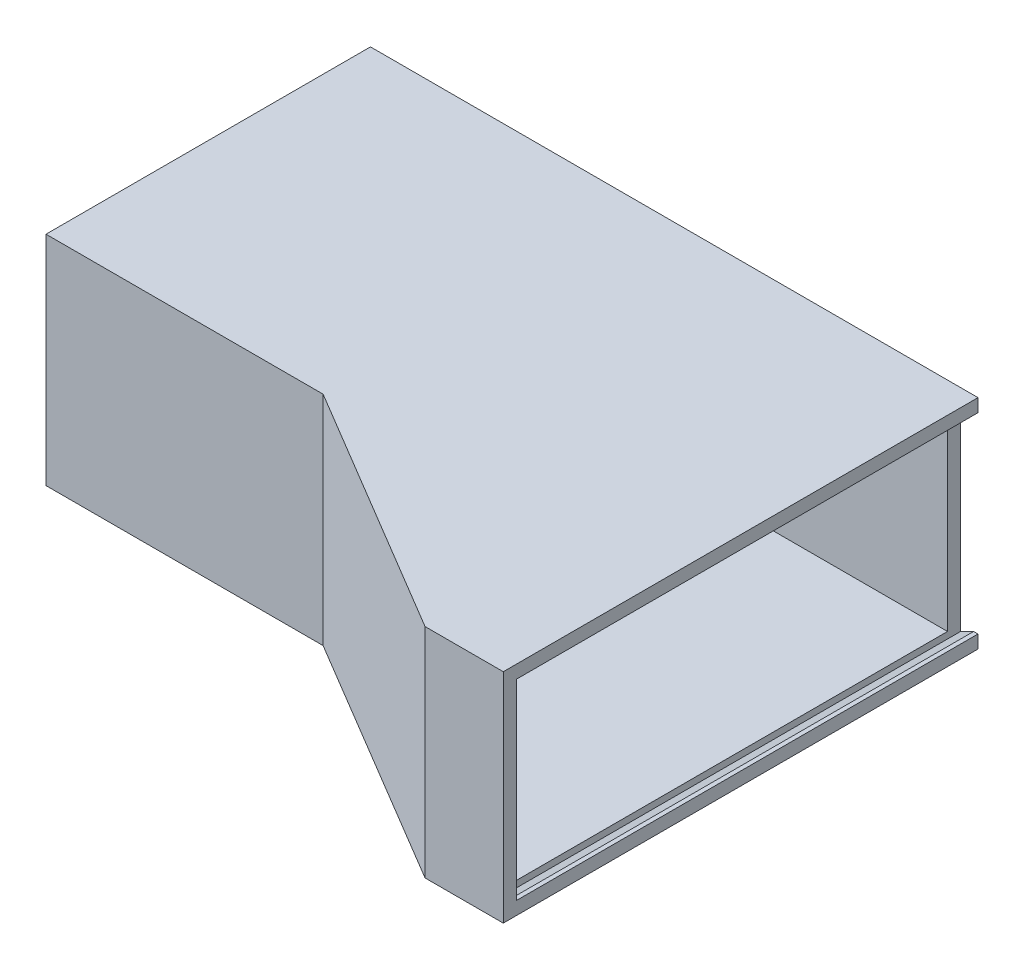
ISO-10303-21;
HEADER;
FILE_DESCRIPTION(('STEP AP214'),'2;1');
FILE_NAME('part.step','',(''),(''),'','','');
FILE_SCHEMA(('AUTOMOTIVE_DESIGN { 1 0 10303 214 1 1 1 1 }'));
ENDSEC;
DATA;
#1=APPLICATION_CONTEXT('core data for automotive mechanical design processes');
#2=APPLICATION_PROTOCOL_DEFINITION('international standard','automotive_design',2000,#1);
#3=PRODUCT_CONTEXT('',#1,'mechanical');
#4=PRODUCT('Part','Part','',(#3));
#5=PRODUCT_RELATED_PRODUCT_CATEGORY('part','',(#4));
#6=PRODUCT_DEFINITION_FORMATION('','',#4);
#7=PRODUCT_DEFINITION_CONTEXT('part definition',#1,'design');
#8=PRODUCT_DEFINITION('design','',#6,#7);
#9=PRODUCT_DEFINITION_SHAPE('','',#8);
#10=(LENGTH_UNIT() NAMED_UNIT(*) SI_UNIT(.MILLI.,.METRE.));
#11=(NAMED_UNIT(*) PLANE_ANGLE_UNIT() SI_UNIT($,.RADIAN.));
#12=(NAMED_UNIT(*) SI_UNIT($,.STERADIAN.) SOLID_ANGLE_UNIT());
#13=UNCERTAINTY_MEASURE_WITH_UNIT(LENGTH_MEASURE(1.E-05),#10,'distance_accuracy_value','');
#14=(GEOMETRIC_REPRESENTATION_CONTEXT(3) GLOBAL_UNCERTAINTY_ASSIGNED_CONTEXT((#13)) GLOBAL_UNIT_ASSIGNED_CONTEXT((#10,
#11,#12)) REPRESENTATION_CONTEXT('',''));
#15=CARTESIAN_POINT('',(0.,0.,0.));
#16=DIRECTION('',(0.,0.,1.));
#17=DIRECTION('',(1.,0.,0.));
#18=AXIS2_PLACEMENT_3D('',#15,#16,#17);
#19=CARTESIAN_POINT('',(0.,25.,-3.5));
#20=DIRECTION('',(0.,0.,-1.));
#21=DIRECTION('',(-1.,0.,0.));
#22=AXIS2_PLACEMENT_3D('',#19,#20,#21);
#23=PLANE('',#22);
#24=DIRECTION('',(-0.894427190999916,-0.447213595499958,0.));
#25=VECTOR('',#24,1.);
#26=CARTESIAN_POINT('',(35.8,-71.6,-3.5));
#27=LINE('',#26,#25);
#28=CARTESIAN_POINT('',(135.,-22.,-3.5));
#29=VERTEX_POINT('',#28);
#30=CARTESIAN_POINT('',(132.,-23.5,-3.5));
#31=VERTEX_POINT('',#30);
#32=EDGE_CURVE('E180',#29,#31,#27,.T.);
#33=ORIENTED_EDGE('',*,*,#32,.F.);
#34=DIRECTION('',(1.,0.,0.));
#35=VECTOR('',#34,1.);
#36=CARTESIAN_POINT('',(0.,-22.,-3.5));
#37=LINE('',#36,#35);
#38=CARTESIAN_POINT('',(136.,-22.,-3.5));
#39=VERTEX_POINT('',#38);
#40=EDGE_CURVE('E243',#29,#39,#37,.T.);
#41=ORIENTED_EDGE('',*,*,#40,.T.);
#42=DIRECTION('',(0.,-1.,0.));
#43=VECTOR('',#42,1.);
#44=CARTESIAN_POINT('',(136.,-22.,-3.5));
#45=LINE('',#44,#43);
#46=CARTESIAN_POINT('',(136.,-25.,-3.5));
#47=VERTEX_POINT('',#46);
#48=EDGE_CURVE('E250',#39,#47,#45,.T.);
#49=ORIENTED_EDGE('',*,*,#48,.T.);
#50=DIRECTION('',(1.,0.,0.));
#51=VECTOR('',#50,1.);
#52=CARTESIAN_POINT('',(0.,-25.,-3.5));
#53=LINE('',#52,#51);
#54=CARTESIAN_POINT('',(-3.5,-25.,-3.5));
#55=VERTEX_POINT('',#54);
#56=EDGE_CURVE('E274',#55,#47,#53,.T.);
#57=ORIENTED_EDGE('',*,*,#56,.F.);
#58=DIRECTION('',(0.,-1.,0.));
#59=VECTOR('',#58,1.);
#60=CARTESIAN_POINT('',(-3.5,25.,-3.5));
#61=LINE('',#60,#59);
#62=CARTESIAN_POINT('',(-3.5,25.,-3.5));
#63=VERTEX_POINT('',#62);
#64=EDGE_CURVE('E202',#63,#55,#61,.T.);
#65=ORIENTED_EDGE('',*,*,#64,.F.);
#66=DIRECTION('',(1.,0.,0.));
#67=VECTOR('',#66,1.);
#68=CARTESIAN_POINT('',(0.,25.,-3.5));
#69=LINE('',#68,#67);
#70=CARTESIAN_POINT('',(136.,25.,-3.5));
#71=VERTEX_POINT('',#70);
#72=EDGE_CURVE('E332',#63,#71,#69,.T.);
#73=ORIENTED_EDGE('',*,*,#72,.T.);
#74=DIRECTION('',(0.,1.,0.));
#75=VECTOR('',#74,1.);
#76=CARTESIAN_POINT('',(136.,22.,-3.5));
#77=LINE('',#76,#75);
#78=CARTESIAN_POINT('',(136.,22.,-3.5));
#79=VERTEX_POINT('',#78);
#80=EDGE_CURVE('E328',#79,#71,#77,.T.);
#81=ORIENTED_EDGE('',*,*,#80,.F.);
#82=DIRECTION('',(1.,0.,0.));
#83=VECTOR('',#82,1.);
#84=CARTESIAN_POINT('',(0.,22.,-3.5));
#85=LINE('',#84,#83);
#86=CARTESIAN_POINT('',(135.,22.,-3.5));
#87=VERTEX_POINT('',#86);
#88=EDGE_CURVE('E309',#87,#79,#85,.T.);
#89=ORIENTED_EDGE('',*,*,#88,.F.);
#90=DIRECTION('',(-0.894427190999916,0.447213595499958,0.));
#91=VECTOR('',#90,1.);
#92=CARTESIAN_POINT('',(35.8,71.6,-3.5));
#93=LINE('',#92,#91);
#94=CARTESIAN_POINT('',(132.,23.5,-3.5));
#95=VERTEX_POINT('',#94);
#96=EDGE_CURVE('E197',#87,#95,#93,.T.);
#97=ORIENTED_EDGE('',*,*,#96,.T.);
#98=DIRECTION('',(0.,-1.,0.));
#99=VECTOR('',#98,1.);
#100=CARTESIAN_POINT('',(132.,25.,-3.5));
#101=LINE('',#100,#99);
#102=EDGE_CURVE('E194',#95,#31,#101,.T.);
#103=ORIENTED_EDGE('',*,*,#102,.T.);
#104=EDGE_LOOP('',(#33,#41,#49,#57,#65,#73,#81,#89,#97,#103));
#105=FACE_BOUND('',#104,.T.);
#106=ADVANCED_FACE('F47',(#105),#23,.T.);
#107=CARTESIAN_POINT('',(0.,-22.,0.));
#108=DIRECTION('',(0.,-1.,0.));
#109=DIRECTION('',(0.,0.,1.));
#110=AXIS2_PLACEMENT_3D('',#107,#108,#109);
#111=PLANE('',#110);
#112=DIRECTION('',(0.,0.,-1.));
#113=VECTOR('',#112,1.);
#114=CARTESIAN_POINT('',(132.,-22.,-3.5));
#115=LINE('',#114,#113);
#116=CARTESIAN_POINT('',(132.,-22.,102.5));
#117=VERTEX_POINT('',#116);
#118=CARTESIAN_POINT('',(132.,-22.,-0.5));
#119=VERTEX_POINT('',#118);
#120=EDGE_CURVE('E215',#117,#119,#115,.T.);
#121=ORIENTED_EDGE('',*,*,#120,.T.);
#122=DIRECTION('',(1.,0.,0.));
#123=VECTOR('',#122,1.);
#124=CARTESIAN_POINT('',(0.,-22.,-0.5));
#125=LINE('',#124,#123);
#126=CARTESIAN_POINT('',(-0.5,-22.,-0.5));
#127=VERTEX_POINT('',#126);
#128=EDGE_CURVE('E239',#127,#119,#125,.T.);
#129=ORIENTED_EDGE('',*,*,#128,.F.);
#130=DIRECTION('',(0.,0.,-1.));
#131=VECTOR('',#130,1.);
#132=CARTESIAN_POINT('',(-0.5,-22.,0.));
#133=LINE('',#132,#131);
#134=CARTESIAN_POINT('',(-0.5,-22.,68.));
#135=VERTEX_POINT('',#134);
#136=EDGE_CURVE('E235',#135,#127,#133,.T.);
#137=ORIENTED_EDGE('',*,*,#136,.F.);
#138=DIRECTION('',(-1.,0.,0.));
#139=VECTOR('',#138,1.);
#140=CARTESIAN_POINT('',(0.,-22.,68.));
#141=LINE('',#140,#139);
#142=CARTESIAN_POINT('',(71.5,-22.,68.));
#143=VERTEX_POINT('',#142);
#144=EDGE_CURVE('E231',#143,#135,#141,.T.);
#145=ORIENTED_EDGE('',*,*,#144,.F.);
#146=DIRECTION('',(0.,0.,-1.));
#147=VECTOR('',#146,1.);
#148=CARTESIAN_POINT('',(71.5,-22.,0.));
#149=LINE('',#148,#147);
#150=CARTESIAN_POINT('',(71.5,-22.,74.2841310368762));
#151=VERTEX_POINT('',#150);
#152=EDGE_CURVE('E227',#151,#143,#149,.T.);
#153=ORIENTED_EDGE('',*,*,#152,.F.);
#154=DIRECTION('',(-0.859101543908756,0.,-0.511805175094578));
#155=VECTOR('',#154,1.);
#156=CARTESIAN_POINT('',(-13.9331494970027,-22.,23.3877866556831));
#157=LINE('',#156,#155);
#158=CARTESIAN_POINT('',(118.862351473815,-22.,102.5));
#159=VERTEX_POINT('',#158);
#160=EDGE_CURVE('E223',#159,#151,#157,.T.);
#161=ORIENTED_EDGE('',*,*,#160,.F.);
#162=DIRECTION('',(-1.,0.,0.));
#163=VECTOR('',#162,1.);
#164=CARTESIAN_POINT('',(0.,-22.,102.5));
#165=LINE('',#164,#163);
#166=EDGE_CURVE('E209',#117,#159,#165,.T.);
#167=ORIENTED_EDGE('',*,*,#166,.F.);
#168=EDGE_LOOP('',(#121,#129,#137,#145,#153,#161,#167));
#169=FACE_BOUND('',#168,.T.);
#170=ADVANCED_FACE('F395',(#169),#111,.F.);
#171=DIRECTION('',(0.,0.,1.));
#172=VECTOR('',#171,1.);
#173=CARTESIAN_POINT('',(135.,-22.,-3.5));
#174=LINE('',#173,#172);
#175=CARTESIAN_POINT('',(135.,-22.,102.5));
#176=VERTEX_POINT('',#175);
#177=EDGE_CURVE('E187',#29,#176,#174,.T.);
#178=ORIENTED_EDGE('',*,*,#177,.T.);
#179=CARTESIAN_POINT('',(136.,-22.,102.5));
#180=VERTEX_POINT('',#179);
#181=EDGE_CURVE('E213',#180,#176,#165,.T.);
#182=ORIENTED_EDGE('',*,*,#181,.F.);
#183=DIRECTION('',(0.,0.,-1.));
#184=VECTOR('',#183,1.);
#185=CARTESIAN_POINT('',(136.,-22.,0.));
#186=LINE('',#185,#184);
#187=EDGE_CURVE('E246',#180,#39,#186,.T.);
#188=ORIENTED_EDGE('',*,*,#187,.T.);
#189=ORIENTED_EDGE('',*,*,#40,.F.);
#190=EDGE_LOOP('',(#178,#182,#188,#189));
#191=FACE_BOUND('',#190,.T.);
#192=ADVANCED_FACE('F446',(#191),#111,.F.);
#193=CARTESIAN_POINT('',(0.,25.,102.5));
#194=DIRECTION('',(0.,0.,-1.));
#195=DIRECTION('',(-1.,0.,0.));
#196=AXIS2_PLACEMENT_3D('',#193,#194,#195);
#197=PLANE('',#196);
#198=ORIENTED_EDGE('',*,*,#181,.T.);
#199=DIRECTION('',(0.,-1.,0.));
#200=VECTOR('',#199,1.);
#201=CARTESIAN_POINT('',(135.,0.,102.5));
#202=LINE('',#201,#200);
#203=CARTESIAN_POINT('',(135.,22.,102.5));
#204=VERTEX_POINT('',#203);
#205=EDGE_CURVE('E284',#204,#176,#202,.T.);
#206=ORIENTED_EDGE('',*,*,#205,.F.);
#207=DIRECTION('',(-1.,0.,0.));
#208=VECTOR('',#207,1.);
#209=CARTESIAN_POINT('',(0.,22.,102.5));
#210=LINE('',#209,#208);
#211=CARTESIAN_POINT('',(136.,22.,102.5));
#212=VERTEX_POINT('',#211);
#213=EDGE_CURVE('E301',#212,#204,#210,.T.);
#214=ORIENTED_EDGE('',*,*,#213,.F.);
#215=DIRECTION('',(0.,-1.,0.));
#216=VECTOR('',#215,1.);
#217=CARTESIAN_POINT('',(136.,25.,102.5));
#218=LINE('',#217,#216);
#219=EDGE_CURVE('E372',#212,#180,#218,.T.);
#220=ORIENTED_EDGE('',*,*,#219,.T.);
#221=EDGE_LOOP('',(#198,#206,#214,#220));
#222=FACE_BOUND('',#221,.T.);
#223=ADVANCED_FACE('F458',(#222),#197,.T.);
#224=DIRECTION('',(0.,1.,0.));
#225=VECTOR('',#224,1.);
#226=CARTESIAN_POINT('',(132.,0.,102.5));
#227=LINE('',#226,#225);
#228=CARTESIAN_POINT('',(132.,22.,102.5));
#229=VERTEX_POINT('',#228);
#230=EDGE_CURVE('E294',#117,#229,#227,.T.);
#231=ORIENTED_EDGE('',*,*,#230,.F.);
#232=ORIENTED_EDGE('',*,*,#166,.T.);
#233=DIRECTION('',(0.,-1.,0.));
#234=VECTOR('',#233,1.);
#235=CARTESIAN_POINT('',(118.862351473815,25.,102.5));
#236=LINE('',#235,#234);
#237=CARTESIAN_POINT('',(118.862351473815,22.,102.5));
#238=VERTEX_POINT('',#237);
#239=EDGE_CURVE('E368',#238,#159,#236,.T.);
#240=ORIENTED_EDGE('',*,*,#239,.F.);
#241=EDGE_CURVE('E293',#229,#238,#210,.T.);
#242=ORIENTED_EDGE('',*,*,#241,.F.);
#243=EDGE_LOOP('',(#231,#232,#240,#242));
#244=FACE_BOUND('',#243,.T.);
#245=ADVANCED_FACE('F415',(#244),#197,.T.);
#246=CARTESIAN_POINT('',(0.,25.,-0.5));
#247=DIRECTION('',(0.,0.,-1.));
#248=DIRECTION('',(-1.,0.,0.));
#249=AXIS2_PLACEMENT_3D('',#246,#247,#248);
#250=PLANE('',#249);
#251=ORIENTED_EDGE('',*,*,#128,.T.);
#252=DIRECTION('',(0.,-1.,0.));
#253=VECTOR('',#252,1.);
#254=CARTESIAN_POINT('',(132.,25.,-0.5));
#255=LINE('',#254,#253);
#256=CARTESIAN_POINT('',(132.,22.,-0.5));
#257=VERTEX_POINT('',#256);
#258=EDGE_CURVE('E56',#257,#119,#255,.T.);
#259=ORIENTED_EDGE('',*,*,#258,.F.);
#260=DIRECTION('',(1.,0.,0.));
#261=VECTOR('',#260,1.);
#262=CARTESIAN_POINT('',(0.,22.,-0.5));
#263=LINE('',#262,#261);
#264=CARTESIAN_POINT('',(-0.5,22.,-0.5));
#265=VERTEX_POINT('',#264);
#266=EDGE_CURVE('E312',#265,#257,#263,.T.);
#267=ORIENTED_EDGE('',*,*,#266,.F.);
#268=DIRECTION('',(0.,-1.,0.));
#269=VECTOR('',#268,1.);
#270=CARTESIAN_POINT('',(-0.5,25.,-0.5));
#271=LINE('',#270,#269);
#272=EDGE_CURVE('E352',#265,#127,#271,.T.);
#273=ORIENTED_EDGE('',*,*,#272,.T.);
#274=EDGE_LOOP('',(#251,#259,#267,#273));
#275=FACE_BOUND('',#274,.T.);
#276=ADVANCED_FACE('F49',(#275),#250,.F.);
#277=CARTESIAN_POINT('',(132.,25.,0.));
#278=DIRECTION('',(-1.,0.,0.));
#279=DIRECTION('',(0.,0.,1.));
#280=AXIS2_PLACEMENT_3D('',#277,#278,#279);
#281=PLANE('',#280);
#282=DIRECTION('',(0.,0.,-1.));
#283=VECTOR('',#282,1.);
#284=CARTESIAN_POINT('',(132.,-23.5,-3.5));
#285=LINE('',#284,#283);
#286=CARTESIAN_POINT('',(132.,-23.5,104.));
#287=VERTEX_POINT('',#286);
#288=EDGE_CURVE('E184',#287,#31,#285,.T.);
#289=ORIENTED_EDGE('',*,*,#288,.T.);
#290=ORIENTED_EDGE('',*,*,#102,.F.);
#291=DIRECTION('',(0.,0.,-1.));
#292=VECTOR('',#291,1.);
#293=CARTESIAN_POINT('',(132.,23.5,-3.5));
#294=LINE('',#293,#292);
#295=CARTESIAN_POINT('',(132.,23.5,104.));
#296=VERTEX_POINT('',#295);
#297=EDGE_CURVE('E281',#296,#95,#294,.T.);
#298=ORIENTED_EDGE('',*,*,#297,.F.);
#299=DIRECTION('',(0.,1.,0.));
#300=VECTOR('',#299,1.);
#301=CARTESIAN_POINT('',(132.,0.,104.));
#302=LINE('',#301,#300);
#303=EDGE_CURVE('E207',#287,#296,#302,.T.);
#304=ORIENTED_EDGE('',*,*,#303,.F.);
#305=EDGE_LOOP('',(#289,#290,#298,#304));
#306=FACE_BOUND('',#305,.T.);
#307=ORIENTED_EDGE('',*,*,#258,.T.);
#308=ORIENTED_EDGE('',*,*,#120,.F.);
#309=ORIENTED_EDGE('',*,*,#230,.T.);
#310=DIRECTION('',(0.,0.,-1.));
#311=VECTOR('',#310,1.);
#312=CARTESIAN_POINT('',(132.,22.,-3.5));
#313=LINE('',#312,#311);
#314=EDGE_CURVE('E280',#229,#257,#313,.T.);
#315=ORIENTED_EDGE('',*,*,#314,.T.);
#316=EDGE_LOOP('',(#307,#308,#309,#315));
#317=FACE_BOUND('',#316,.T.);
#318=ADVANCED_FACE('F205',(#306,#317),#281,.F.);
#319=CARTESIAN_POINT('',(-13.9331494970027,25.,23.3877866556831));
#320=DIRECTION('',(0.511805175094578,0.,-0.859101543908756));
#321=DIRECTION('',(-0.859101543908756,0.,-0.511805175094578));
#322=AXIS2_PLACEMENT_3D('',#319,#320,#321);
#323=PLANE('',#322);
#324=ORIENTED_EDGE('',*,*,#239,.T.);
#325=ORIENTED_EDGE('',*,*,#160,.T.);
#326=DIRECTION('',(0.,-1.,0.));
#327=VECTOR('',#326,1.);
#328=CARTESIAN_POINT('',(71.5,25.,74.2841310368762));
#329=LINE('',#328,#327);
#330=CARTESIAN_POINT('',(71.5,22.,74.2841310368762));
#331=VERTEX_POINT('',#330);
#332=EDGE_CURVE('E364',#331,#151,#329,.T.);
#333=ORIENTED_EDGE('',*,*,#332,.F.);
#334=DIRECTION('',(-0.859101543908756,0.,-0.511805175094578));
#335=VECTOR('',#334,1.);
#336=CARTESIAN_POINT('',(-13.9331494970027,22.,23.3877866556831));
#337=LINE('',#336,#335);
#338=EDGE_CURVE('E325',#238,#331,#337,.T.);
#339=ORIENTED_EDGE('',*,*,#338,.F.);
#340=EDGE_LOOP('',(#324,#325,#333,#339));
#341=FACE_BOUND('',#340,.T.);
#342=ADVANCED_FACE('F412',(#341),#323,.T.);
#343=CARTESIAN_POINT('',(71.5,25.,0.));
#344=DIRECTION('',(1.,0.,0.));
#345=DIRECTION('',(0.,0.,-1.));
#346=AXIS2_PLACEMENT_3D('',#343,#344,#345);
#347=PLANE('',#346);
#348=ORIENTED_EDGE('',*,*,#332,.T.);
#349=ORIENTED_EDGE('',*,*,#152,.T.);
#350=DIRECTION('',(0.,-1.,0.));
#351=VECTOR('',#350,1.);
#352=CARTESIAN_POINT('',(71.5,25.,68.));
#353=LINE('',#352,#351);
#354=CARTESIAN_POINT('',(71.5,22.,68.));
#355=VERTEX_POINT('',#354);
#356=EDGE_CURVE('E360',#355,#143,#353,.T.);
#357=ORIENTED_EDGE('',*,*,#356,.F.);
#358=DIRECTION('',(0.,0.,-1.));
#359=VECTOR('',#358,1.);
#360=CARTESIAN_POINT('',(71.5,22.,0.));
#361=LINE('',#360,#359);
#362=EDGE_CURVE('E322',#331,#355,#361,.T.);
#363=ORIENTED_EDGE('',*,*,#362,.F.);
#364=EDGE_LOOP('',(#348,#349,#357,#363));
#365=FACE_BOUND('',#364,.T.);
#366=ADVANCED_FACE('F407',(#365),#347,.T.);
#367=CARTESIAN_POINT('',(0.,25.,68.));
#368=DIRECTION('',(0.,0.,-1.));
#369=DIRECTION('',(-1.,0.,0.));
#370=AXIS2_PLACEMENT_3D('',#367,#368,#369);
#371=PLANE('',#370);
#372=ORIENTED_EDGE('',*,*,#356,.T.);
#373=ORIENTED_EDGE('',*,*,#144,.T.);
#374=DIRECTION('',(0.,-1.,0.));
#375=VECTOR('',#374,1.);
#376=CARTESIAN_POINT('',(-0.5,25.,68.));
#377=LINE('',#376,#375);
#378=CARTESIAN_POINT('',(-0.5,22.,68.));
#379=VERTEX_POINT('',#378);
#380=EDGE_CURVE('E356',#379,#135,#377,.T.);
#381=ORIENTED_EDGE('',*,*,#380,.F.);
#382=DIRECTION('',(-1.,0.,0.));
#383=VECTOR('',#382,1.);
#384=CARTESIAN_POINT('',(0.,22.,68.));
#385=LINE('',#384,#383);
#386=EDGE_CURVE('E319',#355,#379,#385,.T.);
#387=ORIENTED_EDGE('',*,*,#386,.F.);
#388=EDGE_LOOP('',(#372,#373,#381,#387));
#389=FACE_BOUND('',#388,.T.);
#390=ADVANCED_FACE('F403',(#389),#371,.T.);
#391=CARTESIAN_POINT('',(-0.5,25.,0.));
#392=DIRECTION('',(1.,0.,0.));
#393=DIRECTION('',(0.,0.,-1.));
#394=AXIS2_PLACEMENT_3D('',#391,#392,#393);
#395=PLANE('',#394);
#396=ORIENTED_EDGE('',*,*,#380,.T.);
#397=ORIENTED_EDGE('',*,*,#136,.T.);
#398=ORIENTED_EDGE('',*,*,#272,.F.);
#399=DIRECTION('',(0.,0.,-1.));
#400=VECTOR('',#399,1.);
#401=CARTESIAN_POINT('',(-0.5,22.,0.));
#402=LINE('',#401,#400);
#403=EDGE_CURVE('E316',#379,#265,#402,.T.);
#404=ORIENTED_EDGE('',*,*,#403,.F.);
#405=EDGE_LOOP('',(#396,#397,#398,#404));
#406=FACE_BOUND('',#405,.T.);
#407=ADVANCED_FACE('F398',(#406),#395,.T.);
#408=CARTESIAN_POINT('',(135.,0.,102.5));
#409=DIRECTION('',(0.447213595499958,0.,0.894427190999916));
#410=DIRECTION('',(0.894427190999916,0.,-0.447213595499958));
#411=AXIS2_PLACEMENT_3D('',#408,#409,#410);
#412=PLANE('',#411);
#413=ORIENTED_EDGE('',*,*,#205,.T.);
#414=DIRECTION('',(-0.816496580927726,-0.408248290463863,0.408248290463863));
#415=VECTOR('',#414,1.);
#416=CARTESIAN_POINT('',(142.333333333333,-18.3333333333333,98.8333333333333));
#417=LINE('',#416,#415);
#418=EDGE_CURVE('E191',#176,#287,#417,.T.);
#419=ORIENTED_EDGE('',*,*,#418,.T.);
#420=ORIENTED_EDGE('',*,*,#303,.T.);
#421=DIRECTION('',(-0.816496580927726,0.408248290463863,0.408248290463863));
#422=VECTOR('',#421,1.);
#423=CARTESIAN_POINT('',(142.333333333333,18.3333333333333,98.8333333333333));
#424=LINE('',#423,#422);
#425=EDGE_CURVE('E11',#204,#296,#424,.T.);
#426=ORIENTED_EDGE('',*,*,#425,.F.);
#427=EDGE_LOOP('',(#413,#419,#420,#426));
#428=FACE_BOUND('',#427,.T.);
#429=ADVANCED_FACE('F422',(#428),#412,.F.);
#430=CARTESIAN_POINT('',(0.,22.,0.));
#431=DIRECTION('',(0.,1.,0.));
#432=DIRECTION('',(0.,0.,1.));
#433=AXIS2_PLACEMENT_3D('',#430,#431,#432);
#434=PLANE('',#433);
#435=ORIENTED_EDGE('',*,*,#266,.T.);
#436=ORIENTED_EDGE('',*,*,#314,.F.);
#437=ORIENTED_EDGE('',*,*,#241,.T.);
#438=ORIENTED_EDGE('',*,*,#338,.T.);
#439=ORIENTED_EDGE('',*,*,#362,.T.);
#440=ORIENTED_EDGE('',*,*,#386,.T.);
#441=ORIENTED_EDGE('',*,*,#403,.T.);
#442=EDGE_LOOP('',(#435,#436,#437,#438,#439,#440,#441));
#443=FACE_BOUND('',#442,.T.);
#444=ADVANCED_FACE('F419',(#443),#434,.F.);
#445=CARTESIAN_POINT('',(-3.5,25.,0.));
#446=DIRECTION('',(1.,0.,0.));
#447=DIRECTION('',(0.,0.,-1.));
#448=AXIS2_PLACEMENT_3D('',#445,#446,#447);
#449=PLANE('',#448);
#450=ORIENTED_EDGE('',*,*,#64,.T.);
#451=DIRECTION('',(0.,0.,1.));
#452=VECTOR('',#451,1.);
#453=CARTESIAN_POINT('',(-3.5,-25.,0.));
#454=LINE('',#453,#452);
#455=CARTESIAN_POINT('',(-3.5,-25.,71.));
#456=VERTEX_POINT('',#455);
#457=EDGE_CURVE('E270',#55,#456,#454,.T.);
#458=ORIENTED_EDGE('',*,*,#457,.T.);
#459=DIRECTION('',(0.,-1.,0.));
#460=VECTOR('',#459,1.);
#461=CARTESIAN_POINT('',(-3.5,25.,71.));
#462=LINE('',#461,#460);
#463=CARTESIAN_POINT('',(-3.5,25.,71.));
#464=VERTEX_POINT('',#463);
#465=EDGE_CURVE('E383',#464,#456,#462,.T.);
#466=ORIENTED_EDGE('',*,*,#465,.F.);
#467=DIRECTION('',(0.,0.,1.));
#468=VECTOR('',#467,1.);
#469=CARTESIAN_POINT('',(-3.5,25.,0.));
#470=LINE('',#469,#468);
#471=EDGE_CURVE('E336',#63,#464,#470,.T.);
#472=ORIENTED_EDGE('',*,*,#471,.F.);
#473=EDGE_LOOP('',(#450,#458,#466,#472));
#474=FACE_BOUND('',#473,.T.);
#475=ADVANCED_FACE('F421',(#474),#449,.F.);
#476=CARTESIAN_POINT('',(0.,25.,71.));
#477=DIRECTION('',(0.,0.,-1.));
#478=DIRECTION('',(-1.,0.,0.));
#479=AXIS2_PLACEMENT_3D('',#476,#477,#478);
#480=PLANE('',#479);
#481=ORIENTED_EDGE('',*,*,#465,.T.);
#482=DIRECTION('',(1.,0.,0.));
#483=VECTOR('',#482,1.);
#484=CARTESIAN_POINT('',(0.,-25.,71.));
#485=LINE('',#484,#483);
#486=CARTESIAN_POINT('',(60.1257460309908,-25.,71.));
#487=VERTEX_POINT('',#486);
#488=EDGE_CURVE('E266',#456,#487,#485,.T.);
#489=ORIENTED_EDGE('',*,*,#488,.T.);
#490=DIRECTION('',(0.,-1.,0.));
#491=VECTOR('',#490,1.);
#492=CARTESIAN_POINT('',(60.1257460309908,25.,71.));
#493=LINE('',#492,#491);
#494=CARTESIAN_POINT('',(60.1257460309908,25.,71.));
#495=VERTEX_POINT('',#494);
#496=EDGE_CURVE('E380',#495,#487,#493,.T.);
#497=ORIENTED_EDGE('',*,*,#496,.F.);
#498=DIRECTION('',(1.,0.,0.));
#499=VECTOR('',#498,1.);
#500=CARTESIAN_POINT('',(0.,25.,71.));
#501=LINE('',#500,#499);
#502=EDGE_CURVE('E339',#464,#495,#501,.T.);
#503=ORIENTED_EDGE('',*,*,#502,.F.);
#504=EDGE_LOOP('',(#481,#489,#497,#503));
#505=FACE_BOUND('',#504,.T.);
#506=ADVANCED_FACE('F430',(#505),#480,.F.);
#507=CARTESIAN_POINT('',(-15.4685650222864,25.,25.9650912874093));
#508=DIRECTION('',(-0.511805175094578,0.,0.859101543908756));
#509=DIRECTION('',(0.859101543908756,0.,0.511805175094578));
#510=AXIS2_PLACEMENT_3D('',#507,#508,#509);
#511=PLANE('',#510);
#512=ORIENTED_EDGE('',*,*,#496,.T.);
#513=DIRECTION('',(-0.859101543908756,0.,-0.511805175094578));
#514=VECTOR('',#513,1.);
#515=CARTESIAN_POINT('',(-15.4685650222864,-25.,25.9650912874093));
#516=LINE('',#515,#514);
#517=CARTESIAN_POINT('',(118.036460316705,-25.,105.5));
#518=VERTEX_POINT('',#517);
#519=EDGE_CURVE('E262',#518,#487,#516,.T.);
#520=ORIENTED_EDGE('',*,*,#519,.F.);
#521=DIRECTION('',(0.,-1.,0.));
#522=VECTOR('',#521,1.);
#523=CARTESIAN_POINT('',(118.036460316705,25.,105.5));
#524=LINE('',#523,#522);
#525=CARTESIAN_POINT('',(118.036460316705,25.,105.5));
#526=VERTEX_POINT('',#525);
#527=EDGE_CURVE('E71',#526,#518,#524,.T.);
#528=ORIENTED_EDGE('',*,*,#527,.F.);
#529=DIRECTION('',(-0.859101543908756,0.,-0.511805175094578));
#530=VECTOR('',#529,1.);
#531=CARTESIAN_POINT('',(-15.4685650222864,25.,25.9650912874093));
#532=LINE('',#531,#530);
#533=EDGE_CURVE('E342',#526,#495,#532,.T.);
#534=ORIENTED_EDGE('',*,*,#533,.T.);
#535=EDGE_LOOP('',(#512,#520,#528,#534));
#536=FACE_BOUND('',#535,.T.);
#537=ADVANCED_FACE('F473',(#536),#511,.T.);
#538=CARTESIAN_POINT('',(0.,25.,105.5));
#539=DIRECTION('',(0.,0.,1.));
#540=DIRECTION('',(1.,0.,0.));
#541=AXIS2_PLACEMENT_3D('',#538,#539,#540);
#542=PLANE('',#541);
#543=ORIENTED_EDGE('',*,*,#527,.T.);
#544=DIRECTION('',(-1.,0.,0.));
#545=VECTOR('',#544,1.);
#546=CARTESIAN_POINT('',(0.,-25.,105.5));
#547=LINE('',#546,#545);
#548=CARTESIAN_POINT('',(136.,-25.,105.5));
#549=VERTEX_POINT('',#548);
#550=EDGE_CURVE('E258',#549,#518,#547,.T.);
#551=ORIENTED_EDGE('',*,*,#550,.F.);
#552=DIRECTION('',(0.,-1.,0.));
#553=VECTOR('',#552,1.);
#554=CARTESIAN_POINT('',(136.,25.,105.5));
#555=LINE('',#554,#553);
#556=CARTESIAN_POINT('',(136.,25.,105.5));
#557=VERTEX_POINT('',#556);
#558=EDGE_CURVE('E63',#557,#549,#555,.T.);
#559=ORIENTED_EDGE('',*,*,#558,.F.);
#560=DIRECTION('',(-1.,0.,0.));
#561=VECTOR('',#560,1.);
#562=CARTESIAN_POINT('',(0.,25.,105.5));
#563=LINE('',#562,#561);
#564=EDGE_CURVE('E345',#557,#526,#563,.T.);
#565=ORIENTED_EDGE('',*,*,#564,.T.);
#566=EDGE_LOOP('',(#543,#551,#559,#565));
#567=FACE_BOUND('',#566,.T.);
#568=ADVANCED_FACE('F469',(#567),#542,.T.);
#569=CARTESIAN_POINT('',(136.,25.,0.));
#570=DIRECTION('',(1.,0.,0.));
#571=DIRECTION('',(0.,0.,-1.));
#572=AXIS2_PLACEMENT_3D('',#569,#570,#571);
#573=PLANE('',#572);
#574=ORIENTED_EDGE('',*,*,#558,.T.);
#575=DIRECTION('',(0.,0.,1.));
#576=VECTOR('',#575,1.);
#577=CARTESIAN_POINT('',(136.,-25.,0.));
#578=LINE('',#577,#576);
#579=EDGE_CURVE('E254',#47,#549,#578,.T.);
#580=ORIENTED_EDGE('',*,*,#579,.F.);
#581=ORIENTED_EDGE('',*,*,#48,.F.);
#582=ORIENTED_EDGE('',*,*,#187,.F.);
#583=ORIENTED_EDGE('',*,*,#219,.F.);
#584=DIRECTION('',(0.,0.,-1.));
#585=VECTOR('',#584,1.);
#586=CARTESIAN_POINT('',(136.,22.,0.));
#587=LINE('',#586,#585);
#588=EDGE_CURVE('E305',#212,#79,#587,.T.);
#589=ORIENTED_EDGE('',*,*,#588,.T.);
#590=ORIENTED_EDGE('',*,*,#80,.T.);
#591=DIRECTION('',(0.,0.,1.));
#592=VECTOR('',#591,1.);
#593=CARTESIAN_POINT('',(136.,25.,0.));
#594=LINE('',#593,#592);
#595=EDGE_CURVE('E348',#71,#557,#594,.T.);
#596=ORIENTED_EDGE('',*,*,#595,.T.);
#597=EDGE_LOOP('',(#574,#580,#581,#582,#583,#589,#590,#596));
#598=FACE_BOUND('',#597,.T.);
#599=ADVANCED_FACE('F466',(#598),#573,.T.);
#600=CARTESIAN_POINT('',(0.,25.,0.));
#601=DIRECTION('',(0.,1.,0.));
#602=DIRECTION('',(0.,0.,1.));
#603=AXIS2_PLACEMENT_3D('',#600,#601,#602);
#604=PLANE('',#603);
#605=ORIENTED_EDGE('',*,*,#595,.F.);
#606=ORIENTED_EDGE('',*,*,#72,.F.);
#607=ORIENTED_EDGE('',*,*,#471,.T.);
#608=ORIENTED_EDGE('',*,*,#502,.T.);
#609=ORIENTED_EDGE('',*,*,#533,.F.);
#610=ORIENTED_EDGE('',*,*,#564,.F.);
#611=EDGE_LOOP('',(#605,#606,#607,#608,#609,#610));
#612=FACE_BOUND('',#611,.T.);
#613=ADVANCED_FACE('F438',(#612),#604,.T.);
#614=ORIENTED_EDGE('',*,*,#213,.T.);
#615=DIRECTION('',(0.,0.,1.));
#616=VECTOR('',#615,1.);
#617=CARTESIAN_POINT('',(135.,22.,-3.5));
#618=LINE('',#617,#616);
#619=EDGE_CURVE('E285',#87,#204,#618,.T.);
#620=ORIENTED_EDGE('',*,*,#619,.F.);
#621=ORIENTED_EDGE('',*,*,#88,.T.);
#622=ORIENTED_EDGE('',*,*,#588,.F.);
#623=EDGE_LOOP('',(#614,#620,#621,#622));
#624=FACE_BOUND('',#623,.T.);
#625=ADVANCED_FACE('F424',(#624),#434,.F.);
#626=CARTESIAN_POINT('',(35.8,71.6,-3.5));
#627=DIRECTION('',(0.447213595499958,0.894427190999916,0.));
#628=DIRECTION('',(-0.894427190999916,0.447213595499958,0.));
#629=AXIS2_PLACEMENT_3D('',#626,#627,#628);
#630=PLANE('',#629);
#631=ORIENTED_EDGE('',*,*,#619,.T.);
#632=ORIENTED_EDGE('',*,*,#425,.T.);
#633=ORIENTED_EDGE('',*,*,#297,.T.);
#634=ORIENTED_EDGE('',*,*,#96,.F.);
#635=EDGE_LOOP('',(#631,#632,#633,#634));
#636=FACE_BOUND('',#635,.T.);
#637=ADVANCED_FACE('F437',(#636),#630,.F.);
#638=CARTESIAN_POINT('',(0.,-25.,0.));
#639=DIRECTION('',(0.,-1.,0.));
#640=DIRECTION('',(0.,0.,1.));
#641=AXIS2_PLACEMENT_3D('',#638,#639,#640);
#642=PLANE('',#641);
#643=ORIENTED_EDGE('',*,*,#56,.T.);
#644=ORIENTED_EDGE('',*,*,#579,.T.);
#645=ORIENTED_EDGE('',*,*,#550,.T.);
#646=ORIENTED_EDGE('',*,*,#519,.T.);
#647=ORIENTED_EDGE('',*,*,#488,.F.);
#648=ORIENTED_EDGE('',*,*,#457,.F.);
#649=EDGE_LOOP('',(#643,#644,#645,#646,#647,#648));
#650=FACE_BOUND('',#649,.T.);
#651=ADVANCED_FACE('F486',(#650),#642,.T.);
#652=CARTESIAN_POINT('',(35.8,-71.6,-3.5));
#653=DIRECTION('',(-0.447213595499958,0.894427190999916,0.));
#654=DIRECTION('',(-0.894427190999916,-0.447213595499958,0.));
#655=AXIS2_PLACEMENT_3D('',#652,#653,#654);
#656=PLANE('',#655);
#657=ORIENTED_EDGE('',*,*,#418,.F.);
#658=ORIENTED_EDGE('',*,*,#177,.F.);
#659=ORIENTED_EDGE('',*,*,#32,.T.);
#660=ORIENTED_EDGE('',*,*,#288,.F.);
#661=EDGE_LOOP('',(#657,#658,#659,#660));
#662=FACE_BOUND('',#661,.T.);
#663=ADVANCED_FACE('F182',(#662),#656,.T.);
#664=CLOSED_SHELL('',(#106,#170,#192,#223,#245,#276,#318,#342,#366,#390,#407,#429,#444,#475,
#506,#537,#568,#599,#613,#625,#637,#651,#663));
#665=MANIFOLD_SOLID_BREP('B2',#664);
#666=ADVANCED_BREP_SHAPE_REPRESENTATION('',(#18,#665),#14);
#667=SHAPE_DEFINITION_REPRESENTATION(#9,#666);
ENDSEC;
END-ISO-10303-21;
